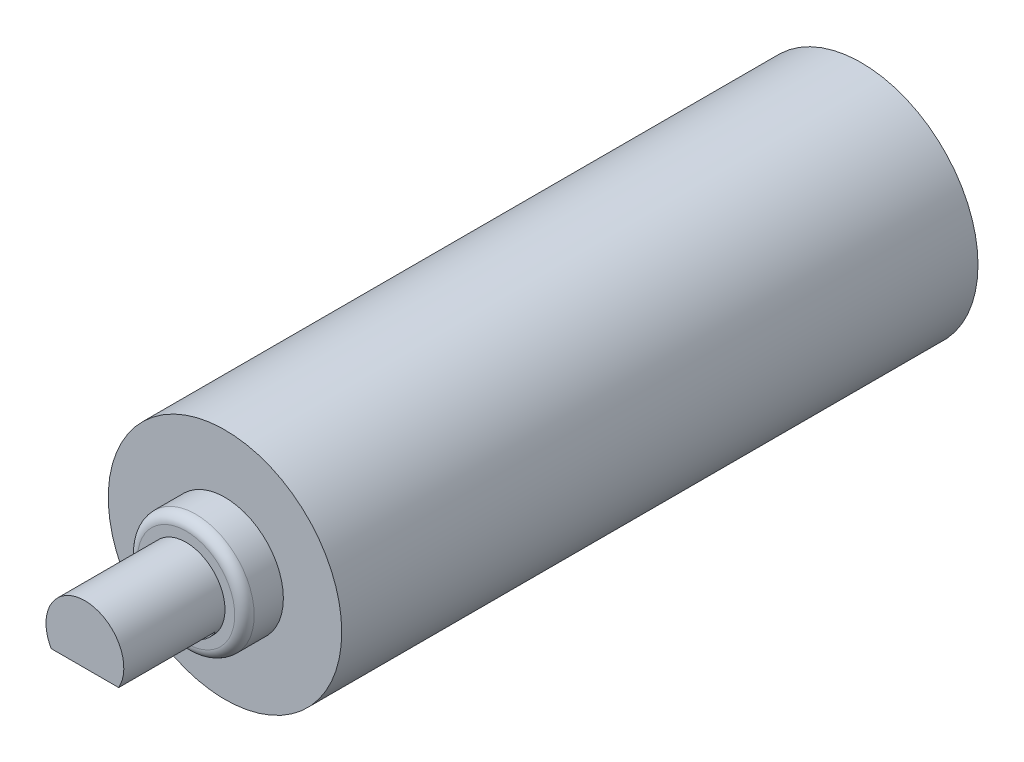
ISO-10303-21;
HEADER;
FILE_DESCRIPTION(('STEP AP214'),'2;1');
FILE_NAME('part.step','',(''),(''),'','','');
FILE_SCHEMA(('AUTOMOTIVE_DESIGN { 1 0 10303 214 1 1 1 1 }'));
ENDSEC;
DATA;
#1=APPLICATION_CONTEXT('core data for automotive mechanical design processes');
#2=APPLICATION_PROTOCOL_DEFINITION('international standard','automotive_design',2000,#1);
#3=PRODUCT_CONTEXT('',#1,'mechanical');
#4=PRODUCT('Part','Part','',(#3));
#5=PRODUCT_RELATED_PRODUCT_CATEGORY('part','',(#4));
#6=PRODUCT_DEFINITION_FORMATION('','',#4);
#7=PRODUCT_DEFINITION_CONTEXT('part definition',#1,'design');
#8=PRODUCT_DEFINITION('design','',#6,#7);
#9=PRODUCT_DEFINITION_SHAPE('','',#8);
#10=(LENGTH_UNIT() NAMED_UNIT(*) SI_UNIT(.MILLI.,.METRE.));
#11=(NAMED_UNIT(*) PLANE_ANGLE_UNIT() SI_UNIT($,.RADIAN.));
#12=(NAMED_UNIT(*) SI_UNIT($,.STERADIAN.) SOLID_ANGLE_UNIT());
#13=UNCERTAINTY_MEASURE_WITH_UNIT(LENGTH_MEASURE(1.E-05),#10,'distance_accuracy_value','');
#14=(GEOMETRIC_REPRESENTATION_CONTEXT(3) GLOBAL_UNCERTAINTY_ASSIGNED_CONTEXT((#13)) GLOBAL_UNIT_ASSIGNED_CONTEXT((#10,
#11,#12)) REPRESENTATION_CONTEXT('',''));
#15=CARTESIAN_POINT('',(0.,0.,0.));
#16=DIRECTION('',(0.,0.,1.));
#17=DIRECTION('',(1.,0.,0.));
#18=AXIS2_PLACEMENT_3D('',#15,#16,#17);
#19=CARTESIAN_POINT('',(0.,0.,-16.35));
#20=DIRECTION('',(0.,0.,1.));
#21=DIRECTION('',(1.,0.,0.));
#22=AXIS2_PLACEMENT_3D('',#19,#20,#21);
#23=CYLINDRICAL_SURFACE('',#22,3.);
#24=CARTESIAN_POINT('',(0.,0.,-16.35));
#25=DIRECTION('',(0.,0.,1.));
#26=DIRECTION('',(1.,0.,0.));
#27=AXIS2_PLACEMENT_3D('',#24,#25,#26);
#28=CIRCLE('',#27,3.);
#29=CARTESIAN_POINT('',(3.,0.,-16.35));
#30=VERTEX_POINT('',#29);
#31=EDGE_CURVE('E99',#30,#30,#28,.T.);
#32=ORIENTED_EDGE('',*,*,#31,.T.);
#33=EDGE_LOOP('',(#32));
#34=FACE_BOUND('',#33,.T.);
#35=CARTESIAN_POINT('',(0.,0.,0.));
#36=DIRECTION('',(0.,0.,1.));
#37=DIRECTION('',(1.,0.,0.));
#38=AXIS2_PLACEMENT_3D('',#35,#36,#37);
#39=CIRCLE('',#38,3.);
#40=CARTESIAN_POINT('',(3.,0.,0.));
#41=VERTEX_POINT('',#40);
#42=EDGE_CURVE('E92',#41,#41,#39,.T.);
#43=ORIENTED_EDGE('',*,*,#42,.F.);
#44=EDGE_LOOP('',(#43));
#45=FACE_BOUND('',#44,.T.);
#46=ADVANCED_FACE('F33',(#34,#45),#23,.T.);
#47=CARTESIAN_POINT('',(0.,0.,-16.35));
#48=DIRECTION('',(0.,0.,1.));
#49=DIRECTION('',(1.,0.,0.));
#50=AXIS2_PLACEMENT_3D('',#47,#48,#49);
#51=PLANE('',#50);
#52=ORIENTED_EDGE('',*,*,#31,.F.);
#53=EDGE_LOOP('',(#52));
#54=FACE_BOUND('',#53,.T.);
#55=ADVANCED_FACE('F119',(#54),#51,.F.);
#56=CARTESIAN_POINT('',(0.,0.,0.));
#57=DIRECTION('',(0.,0.,1.));
#58=DIRECTION('',(1.,0.,0.));
#59=AXIS2_PLACEMENT_3D('',#56,#57,#58);
#60=PLANE('',#59);
#61=CARTESIAN_POINT('',(0.,0.,0.));
#62=DIRECTION('',(0.,0.,1.));
#63=DIRECTION('',(1.,0.,0.));
#64=AXIS2_PLACEMENT_3D('',#61,#62,#63);
#65=CIRCLE('',#64,1.5);
#66=CARTESIAN_POINT('',(1.5,0.,0.));
#67=VERTEX_POINT('',#66);
#68=EDGE_CURVE('E96',#67,#67,#65,.T.);
#69=ORIENTED_EDGE('',*,*,#68,.F.);
#70=EDGE_LOOP('',(#69));
#71=FACE_BOUND('',#70,.T.);
#72=ORIENTED_EDGE('',*,*,#42,.T.);
#73=EDGE_LOOP('',(#72));
#74=FACE_BOUND('',#73,.T.);
#75=ADVANCED_FACE('F124',(#71,#74),#60,.T.);
#76=CARTESIAN_POINT('',(0.,0.,1.));
#77=DIRECTION('',(0.,0.,-1.));
#78=DIRECTION('',(-1.,0.,0.));
#79=AXIS2_PLACEMENT_3D('',#76,#77,#78);
#80=CYLINDRICAL_SURFACE('',#79,1.5);
#81=CARTESIAN_POINT('',(0.,0.,0.75));
#82=DIRECTION('',(0.,0.,1.));
#83=DIRECTION('',(1.,0.,0.));
#84=AXIS2_PLACEMENT_3D('',#81,#82,#83);
#85=CIRCLE('',#84,1.5);
#86=CARTESIAN_POINT('',(1.5,0.,0.75));
#87=VERTEX_POINT('',#86);
#88=EDGE_CURVE('E11',#87,#87,#85,.F.);
#89=ORIENTED_EDGE('',*,*,#88,.T.);
#90=EDGE_LOOP('',(#89));
#91=FACE_BOUND('',#90,.T.);
#92=ORIENTED_EDGE('',*,*,#68,.T.);
#93=EDGE_LOOP('',(#92));
#94=FACE_BOUND('',#93,.T.);
#95=ADVANCED_FACE('F130',(#91,#94),#80,.T.);
#96=CARTESIAN_POINT('',(0.,0.,1.));
#97=DIRECTION('',(0.,0.,1.));
#98=DIRECTION('',(1.,0.,0.));
#99=AXIS2_PLACEMENT_3D('',#96,#97,#98);
#100=PLANE('',#99);
#101=CARTESIAN_POINT('',(0.,0.,1.));
#102=DIRECTION('',(0.,0.,1.));
#103=DIRECTION('',(1.,0.,0.));
#104=AXIS2_PLACEMENT_3D('',#101,#102,#103);
#105=CIRCLE('',#104,1.25);
#106=CARTESIAN_POINT('',(1.25,0.,1.));
#107=VERTEX_POINT('',#106);
#108=EDGE_CURVE('E41',#107,#107,#105,.T.);
#109=ORIENTED_EDGE('',*,*,#108,.T.);
#110=EDGE_LOOP('',(#109));
#111=FACE_BOUND('',#110,.T.);
#112=CARTESIAN_POINT('',(0.,0.,1.));
#113=DIRECTION('',(0.,0.,1.));
#114=DIRECTION('',(1.,0.,0.));
#115=AXIS2_PLACEMENT_3D('',#112,#113,#114);
#116=CIRCLE('',#115,1.);
#117=CARTESIAN_POINT('',(1.,0.,1.));
#118=VERTEX_POINT('',#117);
#119=EDGE_CURVE('E93',#118,#118,#116,.T.);
#120=ORIENTED_EDGE('',*,*,#119,.F.);
#121=EDGE_LOOP('',(#120));
#122=FACE_BOUND('',#121,.T.);
#123=ADVANCED_FACE('F108',(#111,#122),#100,.T.);
#124=CARTESIAN_POINT('',(0.,0.,3.6));
#125=DIRECTION('',(0.,0.,-1.));
#126=DIRECTION('',(-1.,0.,0.));
#127=AXIS2_PLACEMENT_3D('',#124,#125,#126);
#128=CYLINDRICAL_SURFACE('',#127,1.);
#129=CARTESIAN_POINT('',(0.,0.,1.1));
#130=DIRECTION('',(0.,0.,1.));
#131=DIRECTION('',(1.,0.,0.));
#132=AXIS2_PLACEMENT_3D('',#129,#130,#131);
#133=CIRCLE('',#132,1.);
#134=CARTESIAN_POINT('',(-0.866025403784439,-0.5,1.1));
#135=VERTEX_POINT('',#134);
#136=CARTESIAN_POINT('',(0.862464594948922,-0.50611739987832,1.1));
#137=VERTEX_POINT('',#136);
#138=EDGE_CURVE('E55',#135,#137,#133,.T.);
#139=ORIENTED_EDGE('',*,*,#138,.F.);
#140=DIRECTION('',(0.,0.,-1.));
#141=VECTOR('',#140,1.);
#142=CARTESIAN_POINT('',(-0.866025403784439,-0.5,3.6));
#143=LINE('',#142,#141);
#144=CARTESIAN_POINT('',(-0.866025403784438,-0.5,3.6));
#145=VERTEX_POINT('',#144);
#146=EDGE_CURVE('E79',#135,#145,#143,.F.);
#147=ORIENTED_EDGE('',*,*,#146,.T.);
#148=CARTESIAN_POINT('',(0.,0.,3.6));
#149=DIRECTION('',(0.,0.,1.));
#150=DIRECTION('',(1.,0.,0.));
#151=AXIS2_PLACEMENT_3D('',#148,#149,#150);
#152=CIRCLE('',#151,1.);
#153=CARTESIAN_POINT('',(0.862464594948922,-0.50611739987832,3.6));
#154=VERTEX_POINT('',#153);
#155=EDGE_CURVE('E89',#154,#145,#152,.T.);
#156=ORIENTED_EDGE('',*,*,#155,.F.);
#157=DIRECTION('',(0.,0.,-1.));
#158=VECTOR('',#157,1.);
#159=CARTESIAN_POINT('',(0.862464594948922,-0.50611739987832,3.6));
#160=LINE('',#159,#158);
#161=EDGE_CURVE('E48',#154,#137,#160,.T.);
#162=ORIENTED_EDGE('',*,*,#161,.T.);
#163=EDGE_LOOP('',(#139,#147,#156,#162));
#164=FACE_BOUND('',#163,.T.);
#165=ORIENTED_EDGE('',*,*,#119,.T.);
#166=EDGE_LOOP('',(#165));
#167=FACE_BOUND('',#166,.T.);
#168=ADVANCED_FACE('F138',(#164,#167),#128,.T.);
#169=CARTESIAN_POINT('',(0.,0.,3.6));
#170=DIRECTION('',(0.,0.,1.));
#171=DIRECTION('',(1.,0.,0.));
#172=AXIS2_PLACEMENT_3D('',#169,#170,#171);
#173=PLANE('',#172);
#174=DIRECTION('',(-1.,0.,0.));
#175=VECTOR('',#174,1.);
#176=CARTESIAN_POINT('',(0.,-0.5,3.6));
#177=LINE('',#176,#175);
#178=CARTESIAN_POINT('',(0.862464594948922,-0.5,3.6));
#179=VERTEX_POINT('',#178);
#180=EDGE_CURVE('E80',#179,#145,#177,.T.);
#181=ORIENTED_EDGE('',*,*,#180,.F.);
#182=DIRECTION('',(0.,1.,0.));
#183=VECTOR('',#182,1.);
#184=CARTESIAN_POINT('',(0.862464594948922,0.,3.6));
#185=LINE('',#184,#183);
#186=EDGE_CURVE('E83',#154,#179,#185,.T.);
#187=ORIENTED_EDGE('',*,*,#186,.F.);
#188=ORIENTED_EDGE('',*,*,#155,.T.);
#189=EDGE_LOOP('',(#181,#187,#188));
#190=FACE_BOUND('',#189,.T.);
#191=ADVANCED_FACE('F141',(#190),#173,.T.);
#192=CARTESIAN_POINT('',(0.,0.,1.1));
#193=DIRECTION('',(0.,0.,1.));
#194=DIRECTION('',(1.,0.,0.));
#195=AXIS2_PLACEMENT_3D('',#192,#193,#194);
#196=PLANE('',#195);
#197=DIRECTION('',(-1.,0.,0.));
#198=VECTOR('',#197,1.);
#199=CARTESIAN_POINT('',(0.,-0.5,1.1));
#200=LINE('',#199,#198);
#201=CARTESIAN_POINT('',(0.862464594948922,-0.5,1.1));
#202=VERTEX_POINT('',#201);
#203=EDGE_CURVE('E71',#202,#135,#200,.T.);
#204=ORIENTED_EDGE('',*,*,#203,.T.);
#205=ORIENTED_EDGE('',*,*,#138,.T.);
#206=DIRECTION('',(0.,1.,0.));
#207=VECTOR('',#206,1.);
#208=CARTESIAN_POINT('',(0.862464594948922,-0.5,1.1));
#209=LINE('',#208,#207);
#210=EDGE_CURVE('E68',#137,#202,#209,.T.);
#211=ORIENTED_EDGE('',*,*,#210,.T.);
#212=EDGE_LOOP('',(#204,#205,#211));
#213=FACE_BOUND('',#212,.T.);
#214=ADVANCED_FACE('F70',(#213),#196,.T.);
#215=CARTESIAN_POINT('',(0.,-0.5,1.1));
#216=DIRECTION('',(0.,1.,0.));
#217=DIRECTION('',(0.,0.,1.));
#218=AXIS2_PLACEMENT_3D('',#215,#216,#217);
#219=PLANE('',#218);
#220=ORIENTED_EDGE('',*,*,#203,.F.);
#221=DIRECTION('',(0.,0.,1.));
#222=VECTOR('',#221,1.);
#223=CARTESIAN_POINT('',(0.862464594948922,-0.5,1.1));
#224=LINE('',#223,#222);
#225=EDGE_CURVE('E73',#202,#179,#224,.T.);
#226=ORIENTED_EDGE('',*,*,#225,.T.);
#227=ORIENTED_EDGE('',*,*,#180,.T.);
#228=ORIENTED_EDGE('',*,*,#146,.F.);
#229=EDGE_LOOP('',(#220,#226,#227,#228));
#230=FACE_BOUND('',#229,.T.);
#231=ADVANCED_FACE('F77',(#230),#219,.F.);
#232=CARTESIAN_POINT('',(0.862464594948922,-0.5,1.1));
#233=DIRECTION('',(1.,0.,0.));
#234=DIRECTION('',(0.,0.,-1.));
#235=AXIS2_PLACEMENT_3D('',#232,#233,#234);
#236=PLANE('',#235);
#237=ORIENTED_EDGE('',*,*,#186,.T.);
#238=ORIENTED_EDGE('',*,*,#225,.F.);
#239=ORIENTED_EDGE('',*,*,#210,.F.);
#240=ORIENTED_EDGE('',*,*,#161,.F.);
#241=EDGE_LOOP('',(#237,#238,#239,#240));
#242=FACE_BOUND('',#241,.T.);
#243=ADVANCED_FACE('F82',(#242),#236,.F.);
#244=CARTESIAN_POINT('',(0.,0.,0.75));
#245=DIRECTION('',(0.,0.,1.));
#246=DIRECTION('',(1.,0.,0.));
#247=AXIS2_PLACEMENT_3D('',#244,#245,#246);
#248=TOROIDAL_SURFACE('',#247,1.25,0.25);
#249=ORIENTED_EDGE('',*,*,#88,.F.);
#250=EDGE_LOOP('',(#249));
#251=FACE_BOUND('',#250,.T.);
#252=ORIENTED_EDGE('',*,*,#108,.F.);
#253=EDGE_LOOP('',(#252));
#254=FACE_BOUND('',#253,.T.);
#255=ADVANCED_FACE('F35',(#251,#254),#248,.T.);
#256=CLOSED_SHELL('',(#46,#55,#75,#95,#123,#168,#191,#214,#231,#243,#255));
#257=MANIFOLD_SOLID_BREP('B2',#256);
#258=ADVANCED_BREP_SHAPE_REPRESENTATION('',(#18,#257),#14);
#259=SHAPE_DEFINITION_REPRESENTATION(#9,#258);
ENDSEC;
END-ISO-10303-21;
